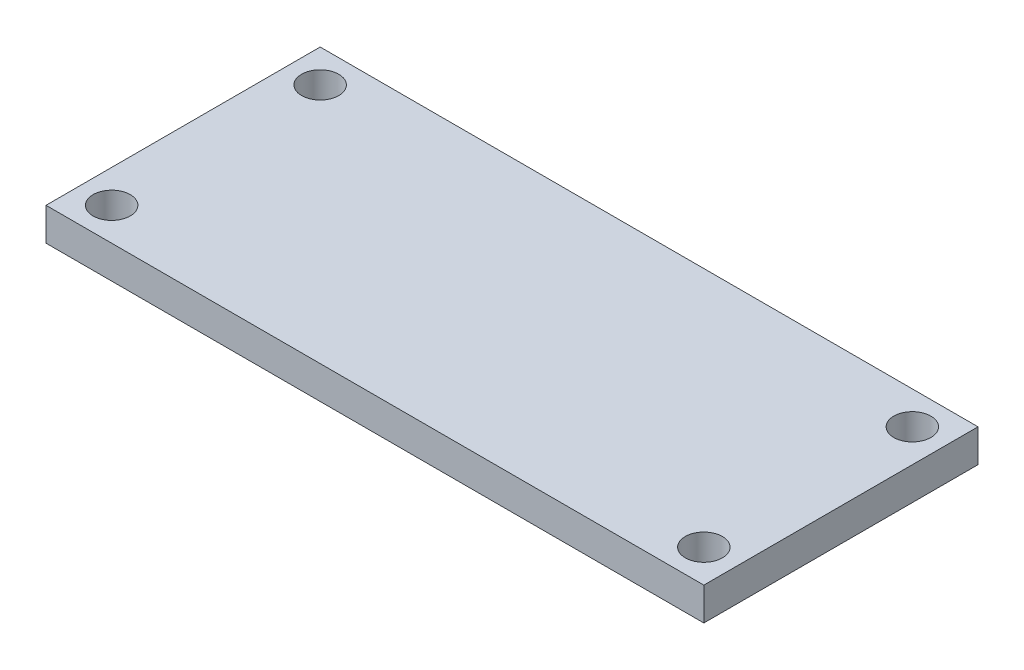
ISO-10303-21;
HEADER;
FILE_DESCRIPTION(('STEP AP214'),'2;1');
FILE_NAME('part.step','',(''),(''),'','','');
FILE_SCHEMA(('AUTOMOTIVE_DESIGN { 1 0 10303 214 1 1 1 1 }'));
ENDSEC;
DATA;
#1=APPLICATION_CONTEXT('core data for automotive mechanical design processes');
#2=APPLICATION_PROTOCOL_DEFINITION('international standard','automotive_design',2000,#1);
#3=PRODUCT_CONTEXT('',#1,'mechanical');
#4=PRODUCT('Part','Part','',(#3));
#5=PRODUCT_RELATED_PRODUCT_CATEGORY('part','',(#4));
#6=PRODUCT_DEFINITION_FORMATION('','',#4);
#7=PRODUCT_DEFINITION_CONTEXT('part definition',#1,'design');
#8=PRODUCT_DEFINITION('design','',#6,#7);
#9=PRODUCT_DEFINITION_SHAPE('','',#8);
#10=(LENGTH_UNIT() NAMED_UNIT(*) SI_UNIT(.MILLI.,.METRE.));
#11=(NAMED_UNIT(*) PLANE_ANGLE_UNIT() SI_UNIT($,.RADIAN.));
#12=(NAMED_UNIT(*) SI_UNIT($,.STERADIAN.) SOLID_ANGLE_UNIT());
#13=UNCERTAINTY_MEASURE_WITH_UNIT(LENGTH_MEASURE(1.E-05),#10,'distance_accuracy_value','');
#14=(GEOMETRIC_REPRESENTATION_CONTEXT(3) GLOBAL_UNCERTAINTY_ASSIGNED_CONTEXT((#13)) GLOBAL_UNIT_ASSIGNED_CONTEXT((#10,
#11,#12)) REPRESENTATION_CONTEXT('',''));
#15=CARTESIAN_POINT('',(0.,0.,0.));
#16=DIRECTION('',(0.,0.,1.));
#17=DIRECTION('',(1.,0.,0.));
#18=AXIS2_PLACEMENT_3D('',#15,#16,#17);
#19=CARTESIAN_POINT('',(40.07,2.,0.));
#20=DIRECTION('',(1.,0.,0.));
#21=DIRECTION('',(0.,0.,-1.));
#22=AXIS2_PLACEMENT_3D('',#19,#20,#21);
#23=PLANE('',#22);
#24=DIRECTION('',(0.,0.,1.));
#25=VECTOR('',#24,1.);
#26=CARTESIAN_POINT('',(40.07,0.,0.));
#27=LINE('',#26,#25);
#28=CARTESIAN_POINT('',(40.07,0.,0.));
#29=VERTEX_POINT('',#28);
#30=CARTESIAN_POINT('',(40.07,0.,16.7));
#31=VERTEX_POINT('',#30);
#32=EDGE_CURVE('E115',#29,#31,#27,.T.);
#33=ORIENTED_EDGE('',*,*,#32,.F.);
#34=DIRECTION('',(0.,-1.,0.));
#35=VECTOR('',#34,1.);
#36=CARTESIAN_POINT('',(40.07,2.,0.));
#37=LINE('',#36,#35);
#38=CARTESIAN_POINT('',(40.07,2.,0.));
#39=VERTEX_POINT('',#38);
#40=EDGE_CURVE('E11',#39,#29,#37,.T.);
#41=ORIENTED_EDGE('',*,*,#40,.F.);
#42=DIRECTION('',(0.,0.,1.));
#43=VECTOR('',#42,1.);
#44=CARTESIAN_POINT('',(40.07,2.,0.));
#45=LINE('',#44,#43);
#46=CARTESIAN_POINT('',(40.07,2.,16.7));
#47=VERTEX_POINT('',#46);
#48=EDGE_CURVE('E96',#39,#47,#45,.T.);
#49=ORIENTED_EDGE('',*,*,#48,.T.);
#50=DIRECTION('',(0.,-1.,0.));
#51=VECTOR('',#50,1.);
#52=CARTESIAN_POINT('',(40.07,2.,16.7));
#53=LINE('',#52,#51);
#54=EDGE_CURVE('E75',#47,#31,#53,.T.);
#55=ORIENTED_EDGE('',*,*,#54,.T.);
#56=EDGE_LOOP('',(#33,#41,#49,#55));
#57=FACE_BOUND('',#56,.T.);
#58=ADVANCED_FACE('F35',(#57),#23,.T.);
#59=CARTESIAN_POINT('',(0.,2.,0.));
#60=DIRECTION('',(0.,0.,-1.));
#61=DIRECTION('',(-1.,0.,0.));
#62=AXIS2_PLACEMENT_3D('',#59,#60,#61);
#63=PLANE('',#62);
#64=DIRECTION('',(1.,0.,0.));
#65=VECTOR('',#64,1.);
#66=CARTESIAN_POINT('',(0.,0.,0.));
#67=LINE('',#66,#65);
#68=CARTESIAN_POINT('',(0.,0.,0.));
#69=VERTEX_POINT('',#68);
#70=EDGE_CURVE('E87',#69,#29,#67,.T.);
#71=ORIENTED_EDGE('',*,*,#70,.F.);
#72=DIRECTION('',(0.,-1.,0.));
#73=VECTOR('',#72,1.);
#74=CARTESIAN_POINT('',(0.,2.,0.));
#75=LINE('',#74,#73);
#76=CARTESIAN_POINT('',(0.,2.,0.));
#77=VERTEX_POINT('',#76);
#78=EDGE_CURVE('E44',#77,#69,#75,.T.);
#79=ORIENTED_EDGE('',*,*,#78,.F.);
#80=DIRECTION('',(1.,0.,0.));
#81=VECTOR('',#80,1.);
#82=CARTESIAN_POINT('',(0.,2.,0.));
#83=LINE('',#82,#81);
#84=EDGE_CURVE('E85',#77,#39,#83,.T.);
#85=ORIENTED_EDGE('',*,*,#84,.T.);
#86=ORIENTED_EDGE('',*,*,#40,.T.);
#87=EDGE_LOOP('',(#71,#79,#85,#86));
#88=FACE_BOUND('',#87,.T.);
#89=ADVANCED_FACE('F83',(#88),#63,.T.);
#90=CARTESIAN_POINT('',(0.,2.,0.));
#91=DIRECTION('',(1.,0.,0.));
#92=DIRECTION('',(0.,0.,-1.));
#93=AXIS2_PLACEMENT_3D('',#90,#91,#92);
#94=PLANE('',#93);
#95=DIRECTION('',(0.,0.,1.));
#96=VECTOR('',#95,1.);
#97=CARTESIAN_POINT('',(0.,0.,0.));
#98=LINE('',#97,#96);
#99=CARTESIAN_POINT('',(0.,0.,16.7));
#100=VERTEX_POINT('',#99);
#101=EDGE_CURVE('E118',#69,#100,#98,.T.);
#102=ORIENTED_EDGE('',*,*,#101,.T.);
#103=DIRECTION('',(0.,-1.,0.));
#104=VECTOR('',#103,1.);
#105=CARTESIAN_POINT('',(0.,2.,16.7));
#106=LINE('',#105,#104);
#107=CARTESIAN_POINT('',(0.,2.,16.7));
#108=VERTEX_POINT('',#107);
#109=EDGE_CURVE('E90',#108,#100,#106,.T.);
#110=ORIENTED_EDGE('',*,*,#109,.F.);
#111=DIRECTION('',(0.,0.,1.));
#112=VECTOR('',#111,1.);
#113=CARTESIAN_POINT('',(0.,2.,0.));
#114=LINE('',#113,#112);
#115=EDGE_CURVE('E92',#77,#108,#114,.T.);
#116=ORIENTED_EDGE('',*,*,#115,.F.);
#117=ORIENTED_EDGE('',*,*,#78,.T.);
#118=EDGE_LOOP('',(#102,#110,#116,#117));
#119=FACE_BOUND('',#118,.T.);
#120=ADVANCED_FACE('F93',(#119),#94,.F.);
#121=CARTESIAN_POINT('',(2.,2.,2.));
#122=DIRECTION('',(0.,-1.,0.));
#123=DIRECTION('',(0.,0.,-1.));
#124=AXIS2_PLACEMENT_3D('',#121,#122,#123);
#125=CYLINDRICAL_SURFACE('',#124,1.1303);
#126=CARTESIAN_POINT('',(2.,2.,2.));
#127=DIRECTION('',(0.,1.,0.));
#128=DIRECTION('',(0.,0.,1.));
#129=AXIS2_PLACEMENT_3D('',#126,#127,#128);
#130=CIRCLE('',#129,1.1303);
#131=CARTESIAN_POINT('',(2.,2.,3.1303));
#132=VERTEX_POINT('',#131);
#133=EDGE_CURVE('E98',#132,#132,#130,.T.);
#134=ORIENTED_EDGE('',*,*,#133,.T.);
#135=EDGE_LOOP('',(#134));
#136=FACE_BOUND('',#135,.T.);
#137=CARTESIAN_POINT('',(2.,0.,2.));
#138=DIRECTION('',(0.,1.,0.));
#139=DIRECTION('',(0.,0.,1.));
#140=AXIS2_PLACEMENT_3D('',#137,#138,#139);
#141=CIRCLE('',#140,1.1303);
#142=CARTESIAN_POINT('',(2.,0.,3.1303));
#143=VERTEX_POINT('',#142);
#144=EDGE_CURVE('E112',#143,#143,#141,.T.);
#145=ORIENTED_EDGE('',*,*,#144,.F.);
#146=EDGE_LOOP('',(#145));
#147=FACE_BOUND('',#146,.T.);
#148=ADVANCED_FACE('F134',(#136,#147),#125,.F.);
#149=CARTESIAN_POINT('',(38.07,2.,14.7));
#150=DIRECTION('',(0.,-1.,0.));
#151=DIRECTION('',(0.,0.,-1.));
#152=AXIS2_PLACEMENT_3D('',#149,#150,#151);
#153=CYLINDRICAL_SURFACE('',#152,1.1303);
#154=CARTESIAN_POINT('',(38.07,2.,14.7));
#155=DIRECTION('',(0.,1.,0.));
#156=DIRECTION('',(0.,0.,1.));
#157=AXIS2_PLACEMENT_3D('',#154,#155,#156);
#158=CIRCLE('',#157,1.1303);
#159=CARTESIAN_POINT('',(38.07,2.,15.8303));
#160=VERTEX_POINT('',#159);
#161=EDGE_CURVE('E240',#160,#160,#158,.T.);
#162=ORIENTED_EDGE('',*,*,#161,.T.);
#163=EDGE_LOOP('',(#162));
#164=FACE_BOUND('',#163,.T.);
#165=CARTESIAN_POINT('',(38.07,0.,14.7));
#166=DIRECTION('',(0.,1.,0.));
#167=DIRECTION('',(0.,0.,1.));
#168=AXIS2_PLACEMENT_3D('',#165,#166,#167);
#169=CIRCLE('',#168,1.1303);
#170=CARTESIAN_POINT('',(38.07,0.,15.8303));
#171=VERTEX_POINT('',#170);
#172=EDGE_CURVE('E109',#171,#171,#169,.T.);
#173=ORIENTED_EDGE('',*,*,#172,.F.);
#174=EDGE_LOOP('',(#173));
#175=FACE_BOUND('',#174,.T.);
#176=ADVANCED_FACE('F137',(#164,#175),#153,.F.);
#177=CARTESIAN_POINT('',(38.07,2.,2.));
#178=DIRECTION('',(0.,-1.,0.));
#179=DIRECTION('',(0.,0.,-1.));
#180=AXIS2_PLACEMENT_3D('',#177,#178,#179);
#181=CYLINDRICAL_SURFACE('',#180,1.1303);
#182=CARTESIAN_POINT('',(38.07,2.,2.));
#183=DIRECTION('',(0.,1.,0.));
#184=DIRECTION('',(0.,0.,1.));
#185=AXIS2_PLACEMENT_3D('',#182,#183,#184);
#186=CIRCLE('',#185,1.1303);
#187=CARTESIAN_POINT('',(38.07,2.,3.1303));
#188=VERTEX_POINT('',#187);
#189=EDGE_CURVE('E151',#188,#188,#186,.T.);
#190=ORIENTED_EDGE('',*,*,#189,.T.);
#191=EDGE_LOOP('',(#190));
#192=FACE_BOUND('',#191,.T.);
#193=CARTESIAN_POINT('',(38.07,0.,2.));
#194=DIRECTION('',(0.,1.,0.));
#195=DIRECTION('',(0.,0.,1.));
#196=AXIS2_PLACEMENT_3D('',#193,#194,#195);
#197=CIRCLE('',#196,1.1303);
#198=CARTESIAN_POINT('',(38.07,0.,3.1303));
#199=VERTEX_POINT('',#198);
#200=EDGE_CURVE('E106',#199,#199,#197,.T.);
#201=ORIENTED_EDGE('',*,*,#200,.F.);
#202=EDGE_LOOP('',(#201));
#203=FACE_BOUND('',#202,.T.);
#204=ADVANCED_FACE('F140',(#192,#203),#181,.F.);
#205=CARTESIAN_POINT('',(2.,2.,14.7));
#206=DIRECTION('',(0.,-1.,0.));
#207=DIRECTION('',(0.,0.,-1.));
#208=AXIS2_PLACEMENT_3D('',#205,#206,#207);
#209=CYLINDRICAL_SURFACE('',#208,1.1303);
#210=CARTESIAN_POINT('',(2.,2.,14.7));
#211=DIRECTION('',(0.,1.,0.));
#212=DIRECTION('',(0.,0.,1.));
#213=AXIS2_PLACEMENT_3D('',#210,#211,#212);
#214=CIRCLE('',#213,1.1303);
#215=CARTESIAN_POINT('',(2.,2.,15.8303));
#216=VERTEX_POINT('',#215);
#217=EDGE_CURVE('E121',#216,#216,#214,.T.);
#218=ORIENTED_EDGE('',*,*,#217,.T.);
#219=EDGE_LOOP('',(#218));
#220=FACE_BOUND('',#219,.T.);
#221=CARTESIAN_POINT('',(2.,0.,14.7));
#222=DIRECTION('',(0.,1.,0.));
#223=DIRECTION('',(0.,0.,1.));
#224=AXIS2_PLACEMENT_3D('',#221,#222,#223);
#225=CIRCLE('',#224,1.1303);
#226=CARTESIAN_POINT('',(2.,0.,15.8303));
#227=VERTEX_POINT('',#226);
#228=EDGE_CURVE('E103',#227,#227,#225,.T.);
#229=ORIENTED_EDGE('',*,*,#228,.F.);
#230=EDGE_LOOP('',(#229));
#231=FACE_BOUND('',#230,.T.);
#232=ADVANCED_FACE('F37',(#220,#231),#209,.F.);
#233=CARTESIAN_POINT('',(0.,2.,16.7));
#234=DIRECTION('',(0.,0.,-1.));
#235=DIRECTION('',(-1.,0.,0.));
#236=AXIS2_PLACEMENT_3D('',#233,#234,#235);
#237=PLANE('',#236);
#238=DIRECTION('',(1.,0.,0.));
#239=VECTOR('',#238,1.);
#240=CARTESIAN_POINT('',(0.,0.,16.7));
#241=LINE('',#240,#239);
#242=EDGE_CURVE('E68',#100,#31,#241,.T.);
#243=ORIENTED_EDGE('',*,*,#242,.T.);
#244=ORIENTED_EDGE('',*,*,#54,.F.);
#245=DIRECTION('',(1.,0.,0.));
#246=VECTOR('',#245,1.);
#247=CARTESIAN_POINT('',(0.,2.,16.7));
#248=LINE('',#247,#246);
#249=EDGE_CURVE('E52',#108,#47,#248,.T.);
#250=ORIENTED_EDGE('',*,*,#249,.F.);
#251=ORIENTED_EDGE('',*,*,#109,.T.);
#252=EDGE_LOOP('',(#243,#244,#250,#251));
#253=FACE_BOUND('',#252,.T.);
#254=ADVANCED_FACE('F124',(#253),#237,.F.);
#255=CARTESIAN_POINT('',(0.,2.,0.));
#256=DIRECTION('',(0.,1.,0.));
#257=DIRECTION('',(0.,0.,1.));
#258=AXIS2_PLACEMENT_3D('',#255,#256,#257);
#259=PLANE('',#258);
#260=ORIENTED_EDGE('',*,*,#217,.F.);
#261=EDGE_LOOP('',(#260));
#262=FACE_BOUND('',#261,.T.);
#263=ORIENTED_EDGE('',*,*,#189,.F.);
#264=EDGE_LOOP('',(#263));
#265=FACE_BOUND('',#264,.T.);
#266=ORIENTED_EDGE('',*,*,#161,.F.);
#267=EDGE_LOOP('',(#266));
#268=FACE_BOUND('',#267,.T.);
#269=ORIENTED_EDGE('',*,*,#133,.F.);
#270=EDGE_LOOP('',(#269));
#271=FACE_BOUND('',#270,.T.);
#272=ORIENTED_EDGE('',*,*,#48,.F.);
#273=ORIENTED_EDGE('',*,*,#84,.F.);
#274=ORIENTED_EDGE('',*,*,#115,.T.);
#275=ORIENTED_EDGE('',*,*,#249,.T.);
#276=EDGE_LOOP('',(#272,#273,#274,#275));
#277=FACE_BOUND('',#276,.T.);
#278=ADVANCED_FACE('F95',(#262,#265,#268,#271,#277),#259,.T.);
#279=CARTESIAN_POINT('',(0.,0.,0.));
#280=DIRECTION('',(0.,1.,0.));
#281=DIRECTION('',(0.,0.,1.));
#282=AXIS2_PLACEMENT_3D('',#279,#280,#281);
#283=PLANE('',#282);
#284=ORIENTED_EDGE('',*,*,#228,.T.);
#285=EDGE_LOOP('',(#284));
#286=FACE_BOUND('',#285,.T.);
#287=ORIENTED_EDGE('',*,*,#200,.T.);
#288=EDGE_LOOP('',(#287));
#289=FACE_BOUND('',#288,.T.);
#290=ORIENTED_EDGE('',*,*,#172,.T.);
#291=EDGE_LOOP('',(#290));
#292=FACE_BOUND('',#291,.T.);
#293=ORIENTED_EDGE('',*,*,#144,.T.);
#294=EDGE_LOOP('',(#293));
#295=FACE_BOUND('',#294,.T.);
#296=ORIENTED_EDGE('',*,*,#32,.T.);
#297=ORIENTED_EDGE('',*,*,#242,.F.);
#298=ORIENTED_EDGE('',*,*,#101,.F.);
#299=ORIENTED_EDGE('',*,*,#70,.T.);
#300=EDGE_LOOP('',(#296,#297,#298,#299));
#301=FACE_BOUND('',#300,.T.);
#302=ADVANCED_FACE('F125',(#286,#289,#292,#295,#301),#283,.F.);
#303=CLOSED_SHELL('',(#58,#89,#120,#148,#176,#204,#232,#254,#278,#302));
#304=MANIFOLD_SOLID_BREP('B2',#303);
#305=ADVANCED_BREP_SHAPE_REPRESENTATION('',(#18,#304),#14);
#306=SHAPE_DEFINITION_REPRESENTATION(#9,#305);
ENDSEC;
END-ISO-10303-21;
